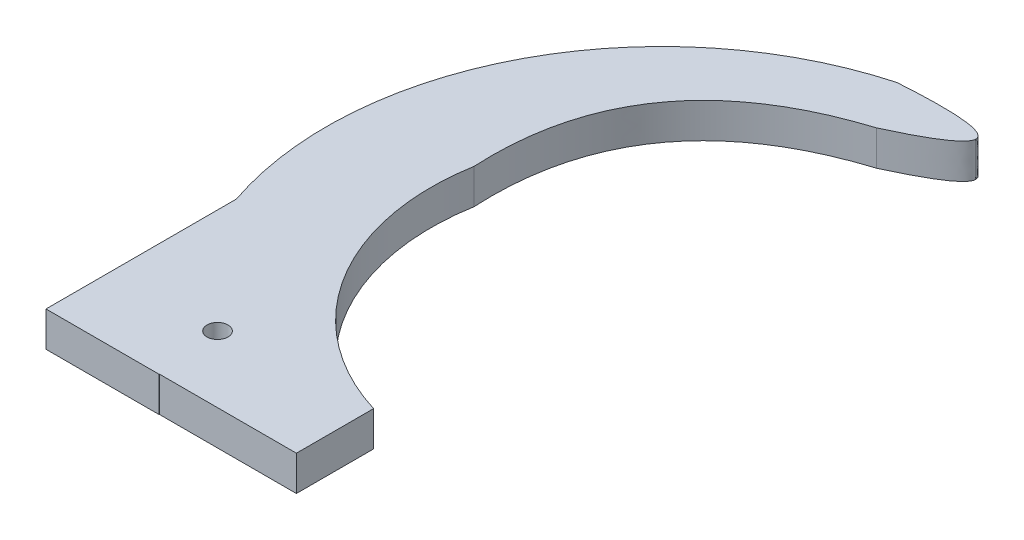
ISO-10303-21;
HEADER;
FILE_DESCRIPTION(('STEP AP214'),'2;1');
FILE_NAME('part.step','',(''),(''),'','','');
FILE_SCHEMA(('AUTOMOTIVE_DESIGN { 1 0 10303 214 1 1 1 1 }'));
ENDSEC;
DATA;
#1=APPLICATION_CONTEXT('core data for automotive mechanical design processes');
#2=APPLICATION_PROTOCOL_DEFINITION('international standard','automotive_design',2000,#1);
#3=PRODUCT_CONTEXT('',#1,'mechanical');
#4=PRODUCT('Part','Part','',(#3));
#5=PRODUCT_RELATED_PRODUCT_CATEGORY('part','',(#4));
#6=PRODUCT_DEFINITION_FORMATION('','',#4);
#7=PRODUCT_DEFINITION_CONTEXT('part definition',#1,'design');
#8=PRODUCT_DEFINITION('design','',#6,#7);
#9=PRODUCT_DEFINITION_SHAPE('','',#8);
#10=(LENGTH_UNIT() NAMED_UNIT(*) SI_UNIT(.MILLI.,.METRE.));
#11=(NAMED_UNIT(*) PLANE_ANGLE_UNIT() SI_UNIT($,.RADIAN.));
#12=(NAMED_UNIT(*) SI_UNIT($,.STERADIAN.) SOLID_ANGLE_UNIT());
#13=UNCERTAINTY_MEASURE_WITH_UNIT(LENGTH_MEASURE(1.E-05),#10,'distance_accuracy_value','');
#14=(GEOMETRIC_REPRESENTATION_CONTEXT(3) GLOBAL_UNCERTAINTY_ASSIGNED_CONTEXT((#13)) GLOBAL_UNIT_ASSIGNED_CONTEXT((#10,
#11,#12)) REPRESENTATION_CONTEXT('',''));
#15=CARTESIAN_POINT('',(0.,0.,0.));
#16=DIRECTION('',(0.,0.,1.));
#17=DIRECTION('',(1.,0.,0.));
#18=AXIS2_PLACEMENT_3D('',#15,#16,#17);
#19=CARTESIAN_POINT('',(0.,2.5,0.));
#20=DIRECTION('',(0.,1.,0.));
#21=DIRECTION('',(0.,0.,1.));
#22=AXIS2_PLACEMENT_3D('',#19,#20,#21);
#23=PLANE('',#22);
#24=DIRECTION('',(0.,0.,1.));
#25=VECTOR('',#24,1.);
#26=CARTESIAN_POINT('',(-9.68283331429237,2.5,30.489883699936));
#27=LINE('',#26,#25);
#28=CARTESIAN_POINT('',(-9.68283331429237,2.5,31.5474680284746));
#29=VERTEX_POINT('',#28);
#30=CARTESIAN_POINT('',(-9.68283331429237,2.5,42.5954812664315));
#31=VERTEX_POINT('',#30);
#32=EDGE_CURVE('E57',#29,#31,#27,.T.);
#33=ORIENTED_EDGE('',*,*,#32,.F.);
#34=CARTESIAN_POINT('',(0.,2.5,0.));
#35=DIRECTION('',(0.,1.,0.));
#36=DIRECTION('',(0.,0.,1.));
#37=AXIS2_PLACEMENT_3D('',#34,#35,#36);
#38=CIRCLE('',#37,33.);
#39=CARTESIAN_POINT('',(-32.5140436823254,2.5,-5.64242531397919));
#40=VERTEX_POINT('',#39);
#41=EDGE_CURVE('E137',#40,#29,#38,.T.);
#42=ORIENTED_EDGE('',*,*,#41,.F.);
#43=CARTESIAN_POINT('',(-8.49120153028585,2.5,-39.2208106771577));
#44=CARTESIAN_POINT('',(-33.8827686019344,2.5,-31.2071067866502));
#45=CARTESIAN_POINT('',(-32.5140436823254,2.5,-5.64242531397919));
#46=B_SPLINE_CURVE_WITH_KNOTS('',2,(#43,#44,#45),.UNSPECIFIED.,.F.,.F.,(3,3),(0.,1.),.UNSPECIFIED.);
#47=CARTESIAN_POINT('',(-8.49120153028585,2.5,-39.2208106771577));
#48=VERTEX_POINT('',#47);
#49=EDGE_CURVE('E191',#48,#40,#46,.T.);
#50=ORIENTED_EDGE('',*,*,#49,.F.);
#51=CARTESIAN_POINT('',(-8.49120153028585,2.5,-39.2208106771577));
#52=CARTESIAN_POINT('',(10.3762901136347,2.5,-47.8691724064916));
#53=CARTESIAN_POINT('',(-12.6737524235885,2.5,-46.2966089417528));
#54=B_SPLINE_CURVE_WITH_KNOTS('',2,(#51,#52,#53),.UNSPECIFIED.,.F.,.F.,(3,3),(0.,1.),.UNSPECIFIED.);
#55=CARTESIAN_POINT('',(0.,2.5,-44.8911396136804));
#56=VERTEX_POINT('',#55);
#57=EDGE_CURVE('E281',#48,#56,#54,.T.);
#58=ORIENTED_EDGE('',*,*,#57,.T.);
#59=DIRECTION('',(0.,0.,1.));
#60=VECTOR('',#59,1.);
#61=CARTESIAN_POINT('',(0.,2.5,0.));
#62=LINE('',#61,#60);
#63=CARTESIAN_POINT('',(0.,2.5,-44.9792306143908));
#64=VERTEX_POINT('',#63);
#65=EDGE_CURVE('E143',#64,#56,#62,.T.);
#66=ORIENTED_EDGE('',*,*,#65,.F.);
#67=CARTESIAN_POINT('',(-8.49120153028585,2.5,-39.2208106771577));
#68=CARTESIAN_POINT('',(10.3762901136347,2.5,-47.8691724064916));
#69=CARTESIAN_POINT('',(-12.6737524235885,2.5,-46.2966089417528));
#70=B_SPLINE_CURVE_WITH_KNOTS('',2,(#67,#68,#69),.UNSPECIFIED.,.F.,.F.,(3,3),(0.,1.),.UNSPECIFIED.);
#71=CARTESIAN_POINT('',(-12.6737524235885,2.5,-46.2966089417528));
#72=VERTEX_POINT('',#71);
#73=EDGE_CURVE('E130',#64,#72,#70,.T.);
#74=ORIENTED_EDGE('',*,*,#73,.T.);
#75=CARTESIAN_POINT('',(0.,2.5,0.));
#76=DIRECTION('',(0.,1.,0.));
#77=DIRECTION('',(0.,0.,1.));
#78=AXIS2_PLACEMENT_3D('',#75,#76,#77);
#79=CIRCLE('',#78,48.);
#80=CARTESIAN_POINT('',(-45.4667335164913,2.5,15.3875320743895));
#81=VERTEX_POINT('',#80);
#82=EDGE_CURVE('E147',#72,#81,#79,.T.);
#83=ORIENTED_EDGE('',*,*,#82,.T.);
#84=DIRECTION('',(0.,0.,1.));
#85=VECTOR('',#84,1.);
#86=CARTESIAN_POINT('',(-45.4667335164913,2.5,0.));
#87=LINE('',#86,#85);
#88=CARTESIAN_POINT('',(-45.4667335164913,2.5,42.6368813254414));
#89=VERTEX_POINT('',#88);
#90=EDGE_CURVE('E157',#81,#89,#87,.T.);
#91=ORIENTED_EDGE('',*,*,#90,.T.);
#92=DIRECTION('',(1.,0.,0.));
#93=VECTOR('',#92,1.);
#94=CARTESIAN_POINT('',(-51.8053540338331,2.5,42.6368813254414));
#95=LINE('',#94,#93);
#96=CARTESIAN_POINT('',(-29.2862453959659,2.5,42.6368813254414));
#97=VERTEX_POINT('',#96);
#98=EDGE_CURVE('E221',#89,#97,#95,.T.);
#99=ORIENTED_EDGE('',*,*,#98,.T.);
#100=DIRECTION('',(0.,0.,1.));
#101=VECTOR('',#100,1.);
#102=CARTESIAN_POINT('',(-29.2862453959659,2.5,42.5954812664315));
#103=LINE('',#102,#101);
#104=CARTESIAN_POINT('',(-29.2862453959659,2.5,42.5954812664315));
#105=VERTEX_POINT('',#104);
#106=EDGE_CURVE('E202',#105,#97,#103,.T.);
#107=ORIENTED_EDGE('',*,*,#106,.F.);
#108=DIRECTION('',(-1.,0.,0.));
#109=VECTOR('',#108,1.);
#110=CARTESIAN_POINT('',(-29.2862453959659,2.5,42.5954812664315));
#111=LINE('',#110,#109);
#112=EDGE_CURVE('E139',#31,#105,#111,.T.);
#113=ORIENTED_EDGE('',*,*,#112,.F.);
#114=EDGE_LOOP('',(#33,#42,#50,#58,#66,#74,#83,#91,#99,#107,#113));
#115=FACE_BOUND('',#114,.T.);
#116=CARTESIAN_POINT('',(-30.4667335164913,2.5,33.0954812664315));
#117=DIRECTION('',(0.,1.,0.));
#118=DIRECTION('',(0.,0.,1.));
#119=AXIS2_PLACEMENT_3D('',#116,#117,#118);
#120=CIRCLE('',#119,1.5);
#121=CARTESIAN_POINT('',(-30.4667335164913,2.5,34.5954812664315));
#122=VERTEX_POINT('',#121);
#123=EDGE_CURVE('E174',#122,#122,#120,.T.);
#124=ORIENTED_EDGE('',*,*,#123,.F.);
#125=EDGE_LOOP('',(#124));
#126=FACE_BOUND('',#125,.T.);
#127=ADVANCED_FACE('F42',(#115,#126),#23,.T.);
#128=CARTESIAN_POINT('',(0.,-2.5,0.));
#129=DIRECTION('',(0.,1.,0.));
#130=DIRECTION('',(0.,0.,1.));
#131=AXIS2_PLACEMENT_3D('',#128,#129,#130);
#132=PLANE('',#131);
#133=CARTESIAN_POINT('',(-30.4667335164913,-2.5,33.0954812664315));
#134=DIRECTION('',(0.,1.,0.));
#135=DIRECTION('',(0.,0.,1.));
#136=AXIS2_PLACEMENT_3D('',#133,#134,#135);
#137=CIRCLE('',#136,1.5);
#138=CARTESIAN_POINT('',(-30.4667335164913,-2.5,34.5954812664315));
#139=VERTEX_POINT('',#138);
#140=EDGE_CURVE('E199',#139,#139,#137,.T.);
#141=ORIENTED_EDGE('',*,*,#140,.T.);
#142=EDGE_LOOP('',(#141));
#143=FACE_BOUND('',#142,.T.);
#144=CARTESIAN_POINT('',(0.,-2.5,0.));
#145=DIRECTION('',(0.,1.,0.));
#146=DIRECTION('',(0.,0.,1.));
#147=AXIS2_PLACEMENT_3D('',#144,#145,#146);
#148=CIRCLE('',#147,33.);
#149=CARTESIAN_POINT('',(-32.5140436823254,-2.5,-5.64242531397919));
#150=VERTEX_POINT('',#149);
#151=CARTESIAN_POINT('',(-9.68283331429237,-2.5,31.5474680284746));
#152=VERTEX_POINT('',#151);
#153=EDGE_CURVE('E161',#150,#152,#148,.T.);
#154=ORIENTED_EDGE('',*,*,#153,.T.);
#155=DIRECTION('',(0.,0.,1.));
#156=VECTOR('',#155,1.);
#157=CARTESIAN_POINT('',(-9.68283331429237,-2.5,0.));
#158=LINE('',#157,#156);
#159=CARTESIAN_POINT('',(-9.68283331429237,-2.5,42.5954812664315));
#160=VERTEX_POINT('',#159);
#161=EDGE_CURVE('E125',#152,#160,#158,.T.);
#162=ORIENTED_EDGE('',*,*,#161,.T.);
#163=DIRECTION('',(-1.,0.,0.));
#164=VECTOR('',#163,1.);
#165=CARTESIAN_POINT('',(-29.2862453959659,-2.5,42.5954812664315));
#166=LINE('',#165,#164);
#167=CARTESIAN_POINT('',(-29.2862453959659,-2.5,42.5954812664315));
#168=VERTEX_POINT('',#167);
#169=EDGE_CURVE('E208',#160,#168,#166,.T.);
#170=ORIENTED_EDGE('',*,*,#169,.T.);
#171=DIRECTION('',(0.,0.,1.));
#172=VECTOR('',#171,1.);
#173=CARTESIAN_POINT('',(-29.2862453959659,-2.5,42.5954812664315));
#174=LINE('',#173,#172);
#175=CARTESIAN_POINT('',(-29.2862453959659,-2.5,42.6368813254414));
#176=VERTEX_POINT('',#175);
#177=EDGE_CURVE('E205',#168,#176,#174,.T.);
#178=ORIENTED_EDGE('',*,*,#177,.T.);
#179=DIRECTION('',(1.,0.,0.));
#180=VECTOR('',#179,1.);
#181=CARTESIAN_POINT('',(0.,-2.5,42.6368813254414));
#182=LINE('',#181,#180);
#183=CARTESIAN_POINT('',(-45.4667335164913,-2.5,42.6368813254414));
#184=VERTEX_POINT('',#183);
#185=EDGE_CURVE('E227',#184,#176,#182,.T.);
#186=ORIENTED_EDGE('',*,*,#185,.F.);
#187=DIRECTION('',(0.,0.,1.));
#188=VECTOR('',#187,1.);
#189=CARTESIAN_POINT('',(-45.4667335164913,-2.5,0.));
#190=LINE('',#189,#188);
#191=CARTESIAN_POINT('',(-45.4667335164913,-2.5,15.3875320743895));
#192=VERTEX_POINT('',#191);
#193=EDGE_CURVE('E144',#192,#184,#190,.T.);
#194=ORIENTED_EDGE('',*,*,#193,.F.);
#195=CARTESIAN_POINT('',(0.,-2.5,0.));
#196=DIRECTION('',(0.,1.,0.));
#197=DIRECTION('',(0.,0.,1.));
#198=AXIS2_PLACEMENT_3D('',#195,#196,#197);
#199=CIRCLE('',#198,48.);
#200=CARTESIAN_POINT('',(-12.6737524235885,-2.5,-46.2966089417528));
#201=VERTEX_POINT('',#200);
#202=EDGE_CURVE('E150',#201,#192,#199,.T.);
#203=ORIENTED_EDGE('',*,*,#202,.F.);
#204=CARTESIAN_POINT('',(-8.49120153028585,-2.5,-39.2208106771577));
#205=CARTESIAN_POINT('',(10.3762901136347,-2.5,-47.8691724064916));
#206=CARTESIAN_POINT('',(-12.6737524235885,-2.5,-46.2966089417528));
#207=B_SPLINE_CURVE_WITH_KNOTS('',2,(#204,#205,#206),.UNSPECIFIED.,.F.,.F.,(3,3),(0.,1.),.UNSPECIFIED.);
#208=CARTESIAN_POINT('',(0.,-2.5,-44.9792306143908));
#209=VERTEX_POINT('',#208);
#210=EDGE_CURVE('E64',#209,#201,#207,.T.);
#211=ORIENTED_EDGE('',*,*,#210,.F.);
#212=DIRECTION('',(0.,0.,1.));
#213=VECTOR('',#212,1.);
#214=CARTESIAN_POINT('',(0.,-2.5,0.));
#215=LINE('',#214,#213);
#216=CARTESIAN_POINT('',(0.,-2.5,-44.8911396136804));
#217=VERTEX_POINT('',#216);
#218=EDGE_CURVE('E163',#209,#217,#215,.T.);
#219=ORIENTED_EDGE('',*,*,#218,.T.);
#220=CARTESIAN_POINT('',(-8.49120153028585,-2.5,-39.2208106771577));
#221=CARTESIAN_POINT('',(10.3762901136347,-2.5,-47.8691724064916));
#222=CARTESIAN_POINT('',(-12.6737524235885,-2.5,-46.2966089417528));
#223=B_SPLINE_CURVE_WITH_KNOTS('',2,(#220,#221,#222),.UNSPECIFIED.,.F.,.F.,(3,3),(0.,1.),.UNSPECIFIED.);
#224=CARTESIAN_POINT('',(-8.49120153028585,-2.5,-39.2208106771577));
#225=VERTEX_POINT('',#224);
#226=EDGE_CURVE('E188',#225,#217,#223,.T.);
#227=ORIENTED_EDGE('',*,*,#226,.F.);
#228=CARTESIAN_POINT('',(-8.49120153028585,-2.5,-39.2208106771577));
#229=CARTESIAN_POINT('',(-33.8827686019344,-2.5,-31.2071067866502));
#230=CARTESIAN_POINT('',(-32.5140436823254,-2.5,-5.64242531397919));
#231=B_SPLINE_CURVE_WITH_KNOTS('',2,(#228,#229,#230),.UNSPECIFIED.,.F.,.F.,(3,3),(0.,1.),.UNSPECIFIED.);
#232=EDGE_CURVE('E169',#225,#150,#231,.T.);
#233=ORIENTED_EDGE('',*,*,#232,.T.);
#234=EDGE_LOOP('',(#154,#162,#170,#178,#186,#194,#203,#211,#219,#227,#233));
#235=FACE_BOUND('',#234,.T.);
#236=ADVANCED_FACE('F187',(#143,#235),#132,.F.);
#237=CARTESIAN_POINT('',(0.,2.5,0.));
#238=DIRECTION('',(1.,0.,0.));
#239=DIRECTION('',(0.,0.,-1.));
#240=AXIS2_PLACEMENT_3D('',#237,#238,#239);
#241=PLANE('',#240);
#242=ORIENTED_EDGE('',*,*,#65,.T.);
#243=DIRECTION('',(0.,1.,0.));
#244=VECTOR('',#243,1.);
#245=CARTESIAN_POINT('',(0.,-7.5,-44.8911396136804));
#246=LINE('',#245,#244);
#247=EDGE_CURVE('E276',#217,#56,#246,.T.);
#248=ORIENTED_EDGE('',*,*,#247,.F.);
#249=ORIENTED_EDGE('',*,*,#218,.F.);
#250=DIRECTION('',(0.,1.,0.));
#251=VECTOR('',#250,1.);
#252=CARTESIAN_POINT('',(0.,-7.5,-44.9792306143908));
#253=LINE('',#252,#251);
#254=EDGE_CURVE('E277',#209,#64,#253,.T.);
#255=ORIENTED_EDGE('',*,*,#254,.T.);
#256=EDGE_LOOP('',(#242,#248,#249,#255));
#257=FACE_BOUND('',#256,.T.);
#258=ADVANCED_FACE('F260',(#257),#241,.T.);
#259=CARTESIAN_POINT('',(0.,2.5,0.));
#260=DIRECTION('',(0.,-1.,0.));
#261=DIRECTION('',(0.,0.,-1.));
#262=AXIS2_PLACEMENT_3D('',#259,#260,#261);
#263=CYLINDRICAL_SURFACE('',#262,48.);
#264=DIRECTION('',(0.,1.,0.));
#265=VECTOR('',#264,1.);
#266=CARTESIAN_POINT('',(-12.6737524235885,-7.5,-46.2966089417528));
#267=LINE('',#266,#265);
#268=EDGE_CURVE('E50',#201,#72,#267,.T.);
#269=ORIENTED_EDGE('',*,*,#268,.F.);
#270=ORIENTED_EDGE('',*,*,#202,.T.);
#271=DIRECTION('',(0.,-1.,0.));
#272=VECTOR('',#271,1.);
#273=CARTESIAN_POINT('',(-45.4667335164913,2.5,15.3875320743895));
#274=LINE('',#273,#272);
#275=EDGE_CURVE('E160',#81,#192,#274,.T.);
#276=ORIENTED_EDGE('',*,*,#275,.F.);
#277=ORIENTED_EDGE('',*,*,#82,.F.);
#278=EDGE_LOOP('',(#269,#270,#276,#277));
#279=FACE_BOUND('',#278,.T.);
#280=ADVANCED_FACE('F264',(#279),#263,.T.);
#281=CARTESIAN_POINT('',(-45.4667335164913,2.5,0.));
#282=DIRECTION('',(1.,0.,0.));
#283=DIRECTION('',(0.,0.,-1.));
#284=AXIS2_PLACEMENT_3D('',#281,#282,#283);
#285=PLANE('',#284);
#286=DIRECTION('',(0.,-1.,0.));
#287=VECTOR('',#286,1.);
#288=CARTESIAN_POINT('',(-45.4667335164913,2.5,42.6368813254414));
#289=LINE('',#288,#287);
#290=EDGE_CURVE('E193',#89,#184,#289,.T.);
#291=ORIENTED_EDGE('',*,*,#290,.F.);
#292=ORIENTED_EDGE('',*,*,#90,.F.);
#293=ORIENTED_EDGE('',*,*,#275,.T.);
#294=ORIENTED_EDGE('',*,*,#193,.T.);
#295=EDGE_LOOP('',(#291,#292,#293,#294));
#296=FACE_BOUND('',#295,.T.);
#297=ADVANCED_FACE('F255',(#296),#285,.F.);
#298=CARTESIAN_POINT('',(-29.2862453959659,-2.5,42.5954812664315));
#299=DIRECTION('',(-1.,0.,0.));
#300=DIRECTION('',(0.,0.,1.));
#301=AXIS2_PLACEMENT_3D('',#298,#299,#300);
#302=PLANE('',#301);
#303=DIRECTION('',(0.,1.,0.));
#304=VECTOR('',#303,1.);
#305=CARTESIAN_POINT('',(-29.2862453959659,-2.5,42.6368813254414));
#306=LINE('',#305,#304);
#307=EDGE_CURVE('E225',#176,#97,#306,.T.);
#308=ORIENTED_EDGE('',*,*,#307,.F.);
#309=ORIENTED_EDGE('',*,*,#177,.F.);
#310=DIRECTION('',(0.,1.,0.));
#311=VECTOR('',#310,1.);
#312=CARTESIAN_POINT('',(-29.2862453959659,-2.5,42.5954812664315));
#313=LINE('',#312,#311);
#314=EDGE_CURVE('E153',#168,#105,#313,.T.);
#315=ORIENTED_EDGE('',*,*,#314,.T.);
#316=ORIENTED_EDGE('',*,*,#106,.T.);
#317=EDGE_LOOP('',(#308,#309,#315,#316));
#318=FACE_BOUND('',#317,.T.);
#319=ADVANCED_FACE('F219',(#318),#302,.F.);
#320=CARTESIAN_POINT('',(0.,2.5,0.));
#321=DIRECTION('',(0.,-1.,0.));
#322=DIRECTION('',(0.,0.,-1.));
#323=AXIS2_PLACEMENT_3D('',#320,#321,#322);
#324=CYLINDRICAL_SURFACE('',#323,33.);
#325=DIRECTION('',(0.,-1.,0.));
#326=VECTOR('',#325,1.);
#327=CARTESIAN_POINT('',(-9.68283331429237,2.5,31.5474680284746));
#328=LINE('',#327,#326);
#329=EDGE_CURVE('E122',#152,#29,#328,.F.);
#330=ORIENTED_EDGE('',*,*,#329,.F.);
#331=ORIENTED_EDGE('',*,*,#153,.F.);
#332=DIRECTION('',(0.,1.,0.));
#333=VECTOR('',#332,1.);
#334=CARTESIAN_POINT('',(-32.5140436823254,-7.5,-5.64242531397919));
#335=LINE('',#334,#333);
#336=EDGE_CURVE('E142',#150,#40,#335,.T.);
#337=ORIENTED_EDGE('',*,*,#336,.T.);
#338=ORIENTED_EDGE('',*,*,#41,.T.);
#339=EDGE_LOOP('',(#330,#331,#337,#338));
#340=FACE_BOUND('',#339,.T.);
#341=ADVANCED_FACE('F44',(#340),#324,.F.);
#342=CARTESIAN_POINT('',(-29.2862453959659,-2.5,42.5954812664315));
#343=DIRECTION('',(0.,0.,-1.));
#344=DIRECTION('',(-1.,0.,0.));
#345=AXIS2_PLACEMENT_3D('',#342,#343,#344);
#346=PLANE('',#345);
#347=ORIENTED_EDGE('',*,*,#169,.F.);
#348=DIRECTION('',(0.,1.,0.));
#349=VECTOR('',#348,1.);
#350=CARTESIAN_POINT('',(-9.68283331429237,-2.5,42.5954812664315));
#351=LINE('',#350,#349);
#352=EDGE_CURVE('E11',#160,#31,#351,.T.);
#353=ORIENTED_EDGE('',*,*,#352,.T.);
#354=ORIENTED_EDGE('',*,*,#112,.T.);
#355=ORIENTED_EDGE('',*,*,#314,.F.);
#356=EDGE_LOOP('',(#347,#353,#354,#355));
#357=FACE_BOUND('',#356,.T.);
#358=ADVANCED_FACE('F215',(#357),#346,.F.);
#359=CARTESIAN_POINT('',(-30.4667335164913,-2.5,33.0954812664315));
#360=DIRECTION('',(0.,1.,0.));
#361=DIRECTION('',(0.,0.,1.));
#362=AXIS2_PLACEMENT_3D('',#359,#360,#361);
#363=CYLINDRICAL_SURFACE('',#362,1.5);
#364=ORIENTED_EDGE('',*,*,#140,.F.);
#365=EDGE_LOOP('',(#364));
#366=FACE_BOUND('',#365,.T.);
#367=ORIENTED_EDGE('',*,*,#123,.T.);
#368=EDGE_LOOP('',(#367));
#369=FACE_BOUND('',#368,.T.);
#370=ADVANCED_FACE('F246',(#366,#369),#363,.F.);
#371=CARTESIAN_POINT('',(-8.49120153028585,-7.5,-39.2208106771577));
#372=CARTESIAN_POINT('',(-33.8827686019344,-7.5,-31.2071067866502));
#373=CARTESIAN_POINT('',(-32.5140436823254,-7.5,-5.64242531397919));
#374=B_SPLINE_CURVE_WITH_KNOTS('',2,(#371,#372,#373),.UNSPECIFIED.,.F.,.F.,(3,3),(0.,1.),.UNSPECIFIED.);
#375=DIRECTION('',(0.,1.,0.));
#376=VECTOR('',#375,1.);
#377=SURFACE_OF_LINEAR_EXTRUSION('',#374,#376);
#378=DIRECTION('',(0.,1.,0.));
#379=VECTOR('',#378,1.);
#380=CARTESIAN_POINT('',(-8.49120153028585,-7.5,-39.2208106771577));
#381=LINE('',#380,#379);
#382=EDGE_CURVE('E171',#225,#48,#381,.T.);
#383=ORIENTED_EDGE('',*,*,#382,.T.);
#384=ORIENTED_EDGE('',*,*,#49,.T.);
#385=ORIENTED_EDGE('',*,*,#336,.F.);
#386=ORIENTED_EDGE('',*,*,#232,.F.);
#387=EDGE_LOOP('',(#383,#384,#385,#386));
#388=FACE_BOUND('',#387,.T.);
#389=ADVANCED_FACE('F190',(#388),#377,.F.);
#390=CARTESIAN_POINT('',(-51.8053540338331,-7.5,42.6368813254414));
#391=DIRECTION('',(0.,0.,1.));
#392=DIRECTION('',(1.,0.,0.));
#393=AXIS2_PLACEMENT_3D('',#390,#391,#392);
#394=PLANE('',#393);
#395=ORIENTED_EDGE('',*,*,#290,.T.);
#396=ORIENTED_EDGE('',*,*,#185,.T.);
#397=ORIENTED_EDGE('',*,*,#307,.T.);
#398=ORIENTED_EDGE('',*,*,#98,.F.);
#399=EDGE_LOOP('',(#395,#396,#397,#398));
#400=FACE_BOUND('',#399,.T.);
#401=ADVANCED_FACE('F245',(#400),#394,.T.);
#402=CARTESIAN_POINT('',(-8.49120153028585,-7.5,-39.2208106771577));
#403=CARTESIAN_POINT('',(10.3762901136347,-7.5,-47.8691724064916));
#404=CARTESIAN_POINT('',(-12.6737524235885,-7.5,-46.2966089417528));
#405=B_SPLINE_CURVE_WITH_KNOTS('',2,(#402,#403,#404),.UNSPECIFIED.,.F.,.F.,(3,3),(0.,1.),.UNSPECIFIED.);
#406=DIRECTION('',(0.,1.,0.));
#407=VECTOR('',#406,1.);
#408=SURFACE_OF_LINEAR_EXTRUSION('',#405,#407);
#409=ORIENTED_EDGE('',*,*,#226,.T.);
#410=ORIENTED_EDGE('',*,*,#247,.T.);
#411=ORIENTED_EDGE('',*,*,#57,.F.);
#412=ORIENTED_EDGE('',*,*,#382,.F.);
#413=EDGE_LOOP('',(#409,#410,#411,#412));
#414=FACE_BOUND('',#413,.T.);
#415=ADVANCED_FACE('F308',(#414),#408,.T.);
#416=CARTESIAN_POINT('',(-8.49120153028585,-7.5,-39.2208106771577));
#417=CARTESIAN_POINT('',(10.3762901136347,-7.5,-47.8691724064916));
#418=CARTESIAN_POINT('',(-12.6737524235885,-7.5,-46.2966089417528));
#419=B_SPLINE_CURVE_WITH_KNOTS('',2,(#416,#417,#418),.UNSPECIFIED.,.F.,.F.,(3,3),(0.,1.),.UNSPECIFIED.);
#420=DIRECTION('',(0.,1.,0.));
#421=VECTOR('',#420,1.);
#422=SURFACE_OF_LINEAR_EXTRUSION('',#419,#421);
#423=ORIENTED_EDGE('',*,*,#210,.T.);
#424=ORIENTED_EDGE('',*,*,#268,.T.);
#425=ORIENTED_EDGE('',*,*,#73,.F.);
#426=ORIENTED_EDGE('',*,*,#254,.F.);
#427=EDGE_LOOP('',(#423,#424,#425,#426));
#428=FACE_BOUND('',#427,.T.);
#429=ADVANCED_FACE('F305',(#428),#422,.T.);
#430=CARTESIAN_POINT('',(-9.68283331429237,-7.5,30.489883699936));
#431=DIRECTION('',(-1.,0.,0.));
#432=DIRECTION('',(0.,0.,1.));
#433=AXIS2_PLACEMENT_3D('',#430,#431,#432);
#434=PLANE('',#433);
#435=ORIENTED_EDGE('',*,*,#329,.T.);
#436=ORIENTED_EDGE('',*,*,#32,.T.);
#437=ORIENTED_EDGE('',*,*,#352,.F.);
#438=ORIENTED_EDGE('',*,*,#161,.F.);
#439=EDGE_LOOP('',(#435,#436,#437,#438));
#440=FACE_BOUND('',#439,.T.);
#441=ADVANCED_FACE('F123',(#440),#434,.F.);
#442=CLOSED_SHELL('',(#127,#236,#258,#280,#297,#319,#341,#358,#370,#389,#401,#415,#429,#441));
#443=MANIFOLD_SOLID_BREP('B2',#442);
#444=ADVANCED_BREP_SHAPE_REPRESENTATION('',(#18,#443),#14);
#445=SHAPE_DEFINITION_REPRESENTATION(#9,#444);
ENDSEC;
END-ISO-10303-21;
